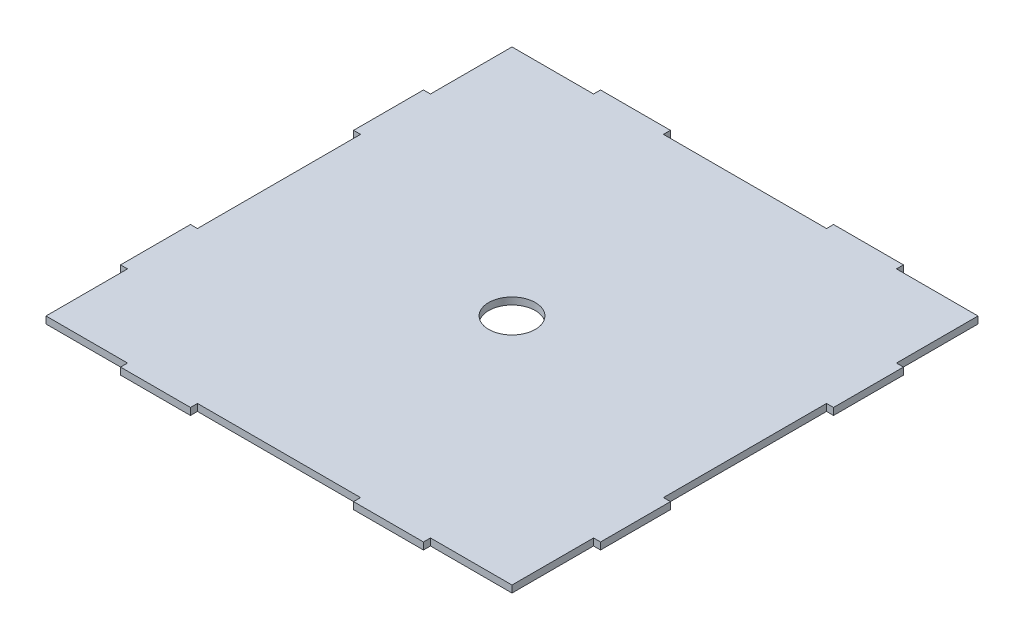
ISO-10303-21;
HEADER;
FILE_DESCRIPTION(('STEP AP214'),'2;1');
FILE_NAME('part.step','',(''),(''),'','','');
FILE_SCHEMA(('AUTOMOTIVE_DESIGN { 1 0 10303 214 1 1 1 1 }'));
ENDSEC;
DATA;
#1=APPLICATION_CONTEXT('core data for automotive mechanical design processes');
#2=APPLICATION_PROTOCOL_DEFINITION('international standard','automotive_design',2000,#1);
#3=PRODUCT_CONTEXT('',#1,'mechanical');
#4=PRODUCT('Part','Part','',(#3));
#5=PRODUCT_RELATED_PRODUCT_CATEGORY('part','',(#4));
#6=PRODUCT_DEFINITION_FORMATION('','',#4);
#7=PRODUCT_DEFINITION_CONTEXT('part definition',#1,'design');
#8=PRODUCT_DEFINITION('design','',#6,#7);
#9=PRODUCT_DEFINITION_SHAPE('','',#8);
#10=(LENGTH_UNIT() NAMED_UNIT(*) SI_UNIT(.MILLI.,.METRE.));
#11=(NAMED_UNIT(*) PLANE_ANGLE_UNIT() SI_UNIT($,.RADIAN.));
#12=(NAMED_UNIT(*) SI_UNIT($,.STERADIAN.) SOLID_ANGLE_UNIT());
#13=UNCERTAINTY_MEASURE_WITH_UNIT(LENGTH_MEASURE(1.E-05),#10,'distance_accuracy_value','');
#14=(GEOMETRIC_REPRESENTATION_CONTEXT(3) GLOBAL_UNCERTAINTY_ASSIGNED_CONTEXT((#13)) GLOBAL_UNIT_ASSIGNED_CONTEXT((#10,
#11,#12)) REPRESENTATION_CONTEXT('',''));
#15=CARTESIAN_POINT('',(0.,0.,0.));
#16=DIRECTION('',(0.,0.,1.));
#17=DIRECTION('',(1.,0.,0.));
#18=AXIS2_PLACEMENT_3D('',#15,#16,#17);
#19=CARTESIAN_POINT('',(-100.,3.,-100.));
#20=DIRECTION('',(0.,0.,1.));
#21=DIRECTION('',(1.,0.,0.));
#22=AXIS2_PLACEMENT_3D('',#19,#20,#21);
#23=PLANE('',#22);
#24=DIRECTION('',(-1.,0.,0.));
#25=VECTOR('',#24,1.);
#26=CARTESIAN_POINT('',(-100.,3.,-100.));
#27=LINE('',#26,#25);
#28=CARTESIAN_POINT('',(35.000000000001,3.,-100.));
#29=VERTEX_POINT('',#28);
#30=CARTESIAN_POINT('',(-34.999999999999,3.,-100.));
#31=VERTEX_POINT('',#30);
#32=EDGE_CURVE('E56',#29,#31,#27,.T.);
#33=ORIENTED_EDGE('',*,*,#32,.F.);
#34=DIRECTION('',(0.,1.,0.));
#35=VECTOR('',#34,1.);
#36=CARTESIAN_POINT('',(35.000000000001,0.,-99.9999999999997));
#37=LINE('',#36,#35);
#38=CARTESIAN_POINT('',(35.000000000001,0.,-99.9999999999997));
#39=VERTEX_POINT('',#38);
#40=EDGE_CURVE('E315',#39,#29,#37,.T.);
#41=ORIENTED_EDGE('',*,*,#40,.F.);
#42=DIRECTION('',(-1.,0.,0.));
#43=VECTOR('',#42,1.);
#44=CARTESIAN_POINT('',(-100.,0.,-100.));
#45=LINE('',#44,#43);
#46=CARTESIAN_POINT('',(-34.999999999999,0.,-100.));
#47=VERTEX_POINT('',#46);
#48=EDGE_CURVE('E613',#39,#47,#45,.T.);
#49=ORIENTED_EDGE('',*,*,#48,.T.);
#50=DIRECTION('',(0.,1.,0.));
#51=VECTOR('',#50,1.);
#52=CARTESIAN_POINT('',(-34.999999999999,0.,-100.));
#53=LINE('',#52,#51);
#54=EDGE_CURVE('E353',#47,#31,#53,.T.);
#55=ORIENTED_EDGE('',*,*,#54,.T.);
#56=EDGE_LOOP('',(#33,#41,#49,#55));
#57=FACE_BOUND('',#56,.T.);
#58=ADVANCED_FACE('F39',(#57),#23,.F.);
#59=DIRECTION('',(0.,1.,0.));
#60=VECTOR('',#59,1.);
#61=CARTESIAN_POINT('',(-64.999999999999,0.,-100.000000000001));
#62=LINE('',#61,#60);
#63=CARTESIAN_POINT('',(-64.999999999999,0.,-100.000000000001));
#64=VERTEX_POINT('',#63);
#65=CARTESIAN_POINT('',(-64.999999999999,3.,-100.000000000001));
#66=VERTEX_POINT('',#65);
#67=EDGE_CURVE('E335',#64,#66,#62,.T.);
#68=ORIENTED_EDGE('',*,*,#67,.F.);
#69=CARTESIAN_POINT('',(-100.,0.,-100.));
#70=VERTEX_POINT('',#69);
#71=EDGE_CURVE('E606',#64,#70,#45,.T.);
#72=ORIENTED_EDGE('',*,*,#71,.T.);
#73=DIRECTION('',(0.,-1.,0.));
#74=VECTOR('',#73,1.);
#75=CARTESIAN_POINT('',(-100.,3.,-100.));
#76=LINE('',#75,#74);
#77=CARTESIAN_POINT('',(-100.,3.,-100.));
#78=VERTEX_POINT('',#77);
#79=EDGE_CURVE('E49',#78,#70,#76,.T.);
#80=ORIENTED_EDGE('',*,*,#79,.F.);
#81=EDGE_CURVE('E584',#66,#78,#27,.T.);
#82=ORIENTED_EDGE('',*,*,#81,.F.);
#83=EDGE_LOOP('',(#68,#72,#80,#82));
#84=FACE_BOUND('',#83,.T.);
#85=ADVANCED_FACE('F664',(#84),#23,.F.);
#86=CARTESIAN_POINT('',(-100.,3.,-100.));
#87=DIRECTION('',(1.,0.,0.));
#88=DIRECTION('',(0.,0.,-1.));
#89=AXIS2_PLACEMENT_3D('',#86,#87,#88);
#90=PLANE('',#89);
#91=DIRECTION('',(0.,0.,1.));
#92=VECTOR('',#91,1.);
#93=CARTESIAN_POINT('',(-100.,3.,-100.));
#94=LINE('',#93,#92);
#95=CARTESIAN_POINT('',(-100.,3.,-35.0000000000007));
#96=VERTEX_POINT('',#95);
#97=CARTESIAN_POINT('',(-100.,3.,34.9999999999993));
#98=VERTEX_POINT('',#97);
#99=EDGE_CURVE('E596',#96,#98,#94,.T.);
#100=ORIENTED_EDGE('',*,*,#99,.F.);
#101=DIRECTION('',(0.,1.,0.));
#102=VECTOR('',#101,1.);
#103=CARTESIAN_POINT('',(-99.9999999999998,0.,-35.0000000000007));
#104=LINE('',#103,#102);
#105=CARTESIAN_POINT('',(-99.9999999999998,0.,-35.0000000000007));
#106=VERTEX_POINT('',#105);
#107=EDGE_CURVE('E382',#106,#96,#104,.T.);
#108=ORIENTED_EDGE('',*,*,#107,.F.);
#109=DIRECTION('',(0.,0.,1.));
#110=VECTOR('',#109,1.);
#111=CARTESIAN_POINT('',(-100.,0.,-100.));
#112=LINE('',#111,#110);
#113=CARTESIAN_POINT('',(-100.,0.,34.9999999999993));
#114=VERTEX_POINT('',#113);
#115=EDGE_CURVE('E618',#106,#114,#112,.T.);
#116=ORIENTED_EDGE('',*,*,#115,.T.);
#117=DIRECTION('',(0.,1.,0.));
#118=VECTOR('',#117,1.);
#119=CARTESIAN_POINT('',(-100.,0.,34.9999999999993));
#120=LINE('',#119,#118);
#121=EDGE_CURVE('E425',#114,#98,#120,.T.);
#122=ORIENTED_EDGE('',*,*,#121,.T.);
#123=EDGE_LOOP('',(#100,#108,#116,#122));
#124=FACE_BOUND('',#123,.T.);
#125=ADVANCED_FACE('F686',(#124),#90,.F.);
#126=DIRECTION('',(0.,1.,0.));
#127=VECTOR('',#126,1.);
#128=CARTESIAN_POINT('',(-100.,0.,64.9999999999993));
#129=LINE('',#128,#127);
#130=CARTESIAN_POINT('',(-100.,0.,64.9999999999993));
#131=VERTEX_POINT('',#130);
#132=CARTESIAN_POINT('',(-100.,3.,64.9999999999993));
#133=VERTEX_POINT('',#132);
#134=EDGE_CURVE('E407',#131,#133,#129,.T.);
#135=ORIENTED_EDGE('',*,*,#134,.F.);
#136=CARTESIAN_POINT('',(-100.,0.,100.));
#137=VERTEX_POINT('',#136);
#138=EDGE_CURVE('E612',#131,#137,#112,.T.);
#139=ORIENTED_EDGE('',*,*,#138,.T.);
#140=DIRECTION('',(0.,-1.,0.));
#141=VECTOR('',#140,1.);
#142=CARTESIAN_POINT('',(-100.,3.,100.));
#143=LINE('',#142,#141);
#144=CARTESIAN_POINT('',(-100.,3.,100.));
#145=VERTEX_POINT('',#144);
#146=EDGE_CURVE('E626',#145,#137,#143,.T.);
#147=ORIENTED_EDGE('',*,*,#146,.F.);
#148=EDGE_CURVE('E590',#133,#145,#94,.T.);
#149=ORIENTED_EDGE('',*,*,#148,.F.);
#150=EDGE_LOOP('',(#135,#139,#147,#149));
#151=FACE_BOUND('',#150,.T.);
#152=ADVANCED_FACE('F694',(#151),#90,.F.);
#153=CARTESIAN_POINT('',(-100.,3.,100.));
#154=DIRECTION('',(0.,0.,-1.));
#155=DIRECTION('',(-1.,0.,0.));
#156=AXIS2_PLACEMENT_3D('',#153,#154,#155);
#157=PLANE('',#156);
#158=DIRECTION('',(1.,0.,0.));
#159=VECTOR('',#158,1.);
#160=CARTESIAN_POINT('',(-100.,3.,100.));
#161=LINE('',#160,#159);
#162=CARTESIAN_POINT('',(-35.0000000000003,3.,100.));
#163=VERTEX_POINT('',#162);
#164=CARTESIAN_POINT('',(34.9999999999997,3.,100.));
#165=VERTEX_POINT('',#164);
#166=EDGE_CURVE('E602',#163,#165,#161,.T.);
#167=ORIENTED_EDGE('',*,*,#166,.F.);
#168=DIRECTION('',(0.,1.,0.));
#169=VECTOR('',#168,1.);
#170=CARTESIAN_POINT('',(-35.0000000000003,0.,99.9999999999999));
#171=LINE('',#170,#169);
#172=CARTESIAN_POINT('',(-35.0000000000003,0.,99.9999999999999));
#173=VERTEX_POINT('',#172);
#174=EDGE_CURVE('E455',#173,#163,#171,.T.);
#175=ORIENTED_EDGE('',*,*,#174,.F.);
#176=DIRECTION('',(1.,0.,0.));
#177=VECTOR('',#176,1.);
#178=CARTESIAN_POINT('',(-100.,0.,100.));
#179=LINE('',#178,#177);
#180=CARTESIAN_POINT('',(34.9999999999997,0.,100.));
#181=VERTEX_POINT('',#180);
#182=EDGE_CURVE('E622',#173,#181,#179,.T.);
#183=ORIENTED_EDGE('',*,*,#182,.T.);
#184=DIRECTION('',(0.,1.,0.));
#185=VECTOR('',#184,1.);
#186=CARTESIAN_POINT('',(34.9999999999997,0.,100.));
#187=LINE('',#186,#185);
#188=EDGE_CURVE('E498',#181,#165,#187,.T.);
#189=ORIENTED_EDGE('',*,*,#188,.T.);
#190=EDGE_LOOP('',(#167,#175,#183,#189));
#191=FACE_BOUND('',#190,.T.);
#192=ADVANCED_FACE('F734',(#191),#157,.F.);
#193=DIRECTION('',(0.,1.,0.));
#194=VECTOR('',#193,1.);
#195=CARTESIAN_POINT('',(64.9999999999997,0.,100.));
#196=LINE('',#195,#194);
#197=CARTESIAN_POINT('',(64.9999999999997,0.,100.));
#198=VERTEX_POINT('',#197);
#199=CARTESIAN_POINT('',(64.9999999999997,3.,100.));
#200=VERTEX_POINT('',#199);
#201=EDGE_CURVE('E480',#198,#200,#196,.T.);
#202=ORIENTED_EDGE('',*,*,#201,.F.);
#203=CARTESIAN_POINT('',(100.,0.,100.));
#204=VERTEX_POINT('',#203);
#205=EDGE_CURVE('E617',#198,#204,#179,.T.);
#206=ORIENTED_EDGE('',*,*,#205,.T.);
#207=DIRECTION('',(0.,-1.,0.));
#208=VECTOR('',#207,1.);
#209=CARTESIAN_POINT('',(100.,3.,100.));
#210=LINE('',#209,#208);
#211=CARTESIAN_POINT('',(100.,3.,100.));
#212=VERTEX_POINT('',#211);
#213=EDGE_CURVE('E601',#212,#204,#210,.T.);
#214=ORIENTED_EDGE('',*,*,#213,.F.);
#215=EDGE_CURVE('E595',#200,#212,#161,.T.);
#216=ORIENTED_EDGE('',*,*,#215,.F.);
#217=EDGE_LOOP('',(#202,#206,#214,#216));
#218=FACE_BOUND('',#217,.T.);
#219=ADVANCED_FACE('F735',(#218),#157,.F.);
#220=CARTESIAN_POINT('',(100.,3.,-100.));
#221=DIRECTION('',(-1.,0.,0.));
#222=DIRECTION('',(0.,0.,1.));
#223=AXIS2_PLACEMENT_3D('',#220,#221,#222);
#224=PLANE('',#223);
#225=DIRECTION('',(0.,0.,-1.));
#226=VECTOR('',#225,1.);
#227=CARTESIAN_POINT('',(100.,3.,-100.));
#228=LINE('',#227,#226);
#229=CARTESIAN_POINT('',(100.,3.,35.));
#230=VERTEX_POINT('',#229);
#231=CARTESIAN_POINT('',(100.,3.,-35.));
#232=VERTEX_POINT('',#231);
#233=EDGE_CURVE('E585',#230,#232,#228,.T.);
#234=ORIENTED_EDGE('',*,*,#233,.F.);
#235=DIRECTION('',(0.,1.,0.));
#236=VECTOR('',#235,1.);
#237=CARTESIAN_POINT('',(100.,0.,35.));
#238=LINE('',#237,#236);
#239=CARTESIAN_POINT('',(100.,0.,35.));
#240=VERTEX_POINT('',#239);
#241=EDGE_CURVE('E528',#240,#230,#238,.T.);
#242=ORIENTED_EDGE('',*,*,#241,.F.);
#243=DIRECTION('',(0.,0.,-1.));
#244=VECTOR('',#243,1.);
#245=CARTESIAN_POINT('',(100.,0.,-100.));
#246=LINE('',#245,#244);
#247=CARTESIAN_POINT('',(100.,0.,-35.));
#248=VERTEX_POINT('',#247);
#249=EDGE_CURVE('E607',#240,#248,#246,.T.);
#250=ORIENTED_EDGE('',*,*,#249,.T.);
#251=DIRECTION('',(0.,1.,0.));
#252=VECTOR('',#251,1.);
#253=CARTESIAN_POINT('',(100.,0.,-35.));
#254=LINE('',#253,#252);
#255=EDGE_CURVE('E553',#248,#232,#254,.T.);
#256=ORIENTED_EDGE('',*,*,#255,.T.);
#257=EDGE_LOOP('',(#234,#242,#250,#256));
#258=FACE_BOUND('',#257,.T.);
#259=ADVANCED_FACE('F697',(#258),#224,.F.);
#260=DIRECTION('',(0.,1.,0.));
#261=VECTOR('',#260,1.);
#262=CARTESIAN_POINT('',(100.,0.,-65.));
#263=LINE('',#262,#261);
#264=CARTESIAN_POINT('',(100.,0.,-65.));
#265=VERTEX_POINT('',#264);
#266=CARTESIAN_POINT('',(100.,3.,-65.));
#267=VERTEX_POINT('',#266);
#268=EDGE_CURVE('E564',#265,#267,#263,.T.);
#269=ORIENTED_EDGE('',*,*,#268,.F.);
#270=CARTESIAN_POINT('',(100.,0.,-100.));
#271=VERTEX_POINT('',#270);
#272=EDGE_CURVE('E608',#265,#271,#246,.T.);
#273=ORIENTED_EDGE('',*,*,#272,.T.);
#274=DIRECTION('',(0.,-1.,0.));
#275=VECTOR('',#274,1.);
#276=CARTESIAN_POINT('',(100.,3.,-100.));
#277=LINE('',#276,#275);
#278=CARTESIAN_POINT('',(100.,3.,-100.));
#279=VERTEX_POINT('',#278);
#280=EDGE_CURVE('E11',#279,#271,#277,.T.);
#281=ORIENTED_EDGE('',*,*,#280,.F.);
#282=EDGE_CURVE('E586',#267,#279,#228,.T.);
#283=ORIENTED_EDGE('',*,*,#282,.F.);
#284=EDGE_LOOP('',(#269,#273,#281,#283));
#285=FACE_BOUND('',#284,.T.);
#286=ADVANCED_FACE('F695',(#285),#224,.F.);
#287=CARTESIAN_POINT('',(100.,0.,65.));
#288=VERTEX_POINT('',#287);
#289=EDGE_CURVE('E603',#204,#288,#246,.T.);
#290=ORIENTED_EDGE('',*,*,#289,.T.);
#291=DIRECTION('',(0.,1.,0.));
#292=VECTOR('',#291,1.);
#293=CARTESIAN_POINT('',(100.,0.,65.));
#294=LINE('',#293,#292);
#295=CARTESIAN_POINT('',(100.,3.,65.));
#296=VERTEX_POINT('',#295);
#297=EDGE_CURVE('E517',#288,#296,#294,.T.);
#298=ORIENTED_EDGE('',*,*,#297,.T.);
#299=EDGE_CURVE('E580',#212,#296,#228,.T.);
#300=ORIENTED_EDGE('',*,*,#299,.F.);
#301=ORIENTED_EDGE('',*,*,#213,.T.);
#302=EDGE_LOOP('',(#290,#298,#300,#301));
#303=FACE_BOUND('',#302,.T.);
#304=ADVANCED_FACE('F41',(#303),#224,.F.);
#305=CARTESIAN_POINT('',(65.0000000000011,0.,-100.));
#306=VERTEX_POINT('',#305);
#307=EDGE_CURVE('E609',#271,#306,#45,.T.);
#308=ORIENTED_EDGE('',*,*,#307,.T.);
#309=DIRECTION('',(0.,1.,0.));
#310=VECTOR('',#309,1.);
#311=CARTESIAN_POINT('',(65.000000000001,0.,-99.9999999999993));
#312=LINE('',#311,#310);
#313=CARTESIAN_POINT('',(65.0000000000011,3.,-100.));
#314=VERTEX_POINT('',#313);
#315=EDGE_CURVE('E64',#306,#314,#312,.T.);
#316=ORIENTED_EDGE('',*,*,#315,.T.);
#317=EDGE_CURVE('E587',#279,#314,#27,.T.);
#318=ORIENTED_EDGE('',*,*,#317,.F.);
#319=ORIENTED_EDGE('',*,*,#280,.T.);
#320=EDGE_LOOP('',(#308,#316,#318,#319));
#321=FACE_BOUND('',#320,.T.);
#322=ADVANCED_FACE('F681',(#321),#23,.F.);
#323=CARTESIAN_POINT('',(-100.,0.,-65.0000000000007));
#324=VERTEX_POINT('',#323);
#325=EDGE_CURVE('E614',#70,#324,#112,.T.);
#326=ORIENTED_EDGE('',*,*,#325,.T.);
#327=DIRECTION('',(0.,1.,0.));
#328=VECTOR('',#327,1.);
#329=CARTESIAN_POINT('',(-99.9999999999996,0.,-65.0000000000007));
#330=LINE('',#329,#328);
#331=CARTESIAN_POINT('',(-100.,3.,-65.0000000000007));
#332=VERTEX_POINT('',#331);
#333=EDGE_CURVE('E371',#324,#332,#330,.T.);
#334=ORIENTED_EDGE('',*,*,#333,.T.);
#335=EDGE_CURVE('E591',#78,#332,#94,.T.);
#336=ORIENTED_EDGE('',*,*,#335,.F.);
#337=ORIENTED_EDGE('',*,*,#79,.T.);
#338=EDGE_LOOP('',(#326,#334,#336,#337));
#339=FACE_BOUND('',#338,.T.);
#340=ADVANCED_FACE('F636',(#339),#90,.F.);
#341=CARTESIAN_POINT('',(-65.0000000000004,0.,100.));
#342=VERTEX_POINT('',#341);
#343=EDGE_CURVE('E619',#137,#342,#179,.T.);
#344=ORIENTED_EDGE('',*,*,#343,.T.);
#345=DIRECTION('',(0.,1.,0.));
#346=VECTOR('',#345,1.);
#347=CARTESIAN_POINT('',(-65.0000000000004,0.,99.9999999999998));
#348=LINE('',#347,#346);
#349=CARTESIAN_POINT('',(-65.0000000000004,3.,100.));
#350=VERTEX_POINT('',#349);
#351=EDGE_CURVE('E444',#342,#350,#348,.T.);
#352=ORIENTED_EDGE('',*,*,#351,.T.);
#353=EDGE_CURVE('E597',#145,#350,#161,.T.);
#354=ORIENTED_EDGE('',*,*,#353,.F.);
#355=ORIENTED_EDGE('',*,*,#146,.T.);
#356=EDGE_LOOP('',(#344,#352,#354,#355));
#357=FACE_BOUND('',#356,.T.);
#358=ADVANCED_FACE('F693',(#357),#157,.F.);
#359=CARTESIAN_POINT('',(0.,3.,0.));
#360=DIRECTION('',(0.,1.,0.));
#361=DIRECTION('',(0.,0.,1.));
#362=AXIS2_PLACEMENT_3D('',#359,#360,#361);
#363=PLANE('',#362);
#364=CARTESIAN_POINT('',(0.,3.,0.));
#365=DIRECTION('',(0.,1.,0.));
#366=DIRECTION('',(0.,0.,1.));
#367=AXIS2_PLACEMENT_3D('',#364,#365,#366);
#368=CIRCLE('',#367,10.);
#369=CARTESIAN_POINT('',(0.,3.,10.));
#370=VERTEX_POINT('',#369);
#371=EDGE_CURVE('E567',#370,#370,#368,.T.);
#372=ORIENTED_EDGE('',*,*,#371,.F.);
#373=EDGE_LOOP('',(#372));
#374=FACE_BOUND('',#373,.T.);
#375=ORIENTED_EDGE('',*,*,#299,.T.);
#376=DIRECTION('',(1.,0.,0.));
#377=VECTOR('',#376,1.);
#378=CARTESIAN_POINT('',(100.,3.,65.));
#379=LINE('',#378,#377);
#380=CARTESIAN_POINT('',(103.,3.,65.));
#381=VERTEX_POINT('',#380);
#382=EDGE_CURVE('E494',#296,#381,#379,.T.);
#383=ORIENTED_EDGE('',*,*,#382,.T.);
#384=DIRECTION('',(0.,0.,-1.));
#385=VECTOR('',#384,1.);
#386=CARTESIAN_POINT('',(103.,3.,65.));
#387=LINE('',#386,#385);
#388=CARTESIAN_POINT('',(103.,3.,35.));
#389=VERTEX_POINT('',#388);
#390=EDGE_CURVE('E521',#381,#389,#387,.T.);
#391=ORIENTED_EDGE('',*,*,#390,.T.);
#392=DIRECTION('',(-1.,0.,0.));
#393=VECTOR('',#392,1.);
#394=CARTESIAN_POINT('',(100.,3.,35.));
#395=LINE('',#394,#393);
#396=EDGE_CURVE('E509',#389,#230,#395,.T.);
#397=ORIENTED_EDGE('',*,*,#396,.T.);
#398=ORIENTED_EDGE('',*,*,#233,.T.);
#399=DIRECTION('',(1.,0.,0.));
#400=VECTOR('',#399,1.);
#401=CARTESIAN_POINT('',(100.,3.,-35.));
#402=LINE('',#401,#400);
#403=CARTESIAN_POINT('',(103.,3.,-35.));
#404=VERTEX_POINT('',#403);
#405=EDGE_CURVE('E532',#232,#404,#402,.T.);
#406=ORIENTED_EDGE('',*,*,#405,.T.);
#407=DIRECTION('',(0.,0.,-1.));
#408=VECTOR('',#407,1.);
#409=CARTESIAN_POINT('',(103.,3.,-65.));
#410=LINE('',#409,#408);
#411=CARTESIAN_POINT('',(103.,3.,-65.));
#412=VERTEX_POINT('',#411);
#413=EDGE_CURVE('E557',#404,#412,#410,.T.);
#414=ORIENTED_EDGE('',*,*,#413,.T.);
#415=DIRECTION('',(-1.,0.,0.));
#416=VECTOR('',#415,1.);
#417=CARTESIAN_POINT('',(100.,3.,-65.));
#418=LINE('',#417,#416);
#419=EDGE_CURVE('E546',#412,#267,#418,.T.);
#420=ORIENTED_EDGE('',*,*,#419,.T.);
#421=ORIENTED_EDGE('',*,*,#282,.T.);
#422=ORIENTED_EDGE('',*,*,#317,.T.);
#423=DIRECTION('',(0.,0.,-1.));
#424=VECTOR('',#423,1.);
#425=CARTESIAN_POINT('',(65.000000000001,3.,-99.9999999999993));
#426=LINE('',#425,#424);
#427=CARTESIAN_POINT('',(65.0000000000011,3.,-102.999999999999));
#428=VERTEX_POINT('',#427);
#429=EDGE_CURVE('E310',#314,#428,#426,.T.);
#430=ORIENTED_EDGE('',*,*,#429,.T.);
#431=DIRECTION('',(-1.,0.,0.));
#432=VECTOR('',#431,1.);
#433=CARTESIAN_POINT('',(65.0000000000011,3.,-102.999999999999));
#434=LINE('',#433,#432);
#435=CARTESIAN_POINT('',(35.0000000000011,3.,-103.));
#436=VERTEX_POINT('',#435);
#437=EDGE_CURVE('E282',#428,#436,#434,.T.);
#438=ORIENTED_EDGE('',*,*,#437,.T.);
#439=DIRECTION('',(0.,0.,1.));
#440=VECTOR('',#439,1.);
#441=CARTESIAN_POINT('',(35.000000000001,3.,-99.9999999999997));
#442=LINE('',#441,#440);
#443=EDGE_CURVE('E302',#436,#29,#442,.T.);
#444=ORIENTED_EDGE('',*,*,#443,.T.);
#445=ORIENTED_EDGE('',*,*,#32,.T.);
#446=DIRECTION('',(0.,0.,-1.));
#447=VECTOR('',#446,1.);
#448=CARTESIAN_POINT('',(-34.999999999999,3.,-100.));
#449=LINE('',#448,#447);
#450=CARTESIAN_POINT('',(-34.9999999999989,3.,-103.));
#451=VERTEX_POINT('',#450);
#452=EDGE_CURVE('E339',#31,#451,#449,.T.);
#453=ORIENTED_EDGE('',*,*,#452,.T.);
#454=DIRECTION('',(-1.,0.,0.));
#455=VECTOR('',#454,1.);
#456=CARTESIAN_POINT('',(-64.9999999999989,3.,-103.000000000001));
#457=LINE('',#456,#455);
#458=CARTESIAN_POINT('',(-64.9999999999989,3.,-103.000000000001));
#459=VERTEX_POINT('',#458);
#460=EDGE_CURVE('E327',#451,#459,#457,.T.);
#461=ORIENTED_EDGE('',*,*,#460,.T.);
#462=DIRECTION('',(0.,0.,1.));
#463=VECTOR('',#462,1.);
#464=CARTESIAN_POINT('',(-64.999999999999,3.,-100.000000000001));
#465=LINE('',#464,#463);
#466=EDGE_CURVE('E318',#459,#66,#465,.T.);
#467=ORIENTED_EDGE('',*,*,#466,.T.);
#468=ORIENTED_EDGE('',*,*,#81,.T.);
#469=ORIENTED_EDGE('',*,*,#335,.T.);
#470=DIRECTION('',(-1.,0.,0.));
#471=VECTOR('',#470,1.);
#472=CARTESIAN_POINT('',(-99.9999999999996,3.,-65.0000000000007));
#473=LINE('',#472,#471);
#474=CARTESIAN_POINT('',(-103.,3.,-65.0000000000007));
#475=VERTEX_POINT('',#474);
#476=EDGE_CURVE('E349',#332,#475,#473,.T.);
#477=ORIENTED_EDGE('',*,*,#476,.T.);
#478=DIRECTION('',(0.,0.,1.));
#479=VECTOR('',#478,1.);
#480=CARTESIAN_POINT('',(-103.,3.,-65.0000000000007));
#481=LINE('',#480,#479);
#482=CARTESIAN_POINT('',(-103.,3.,-35.0000000000007));
#483=VERTEX_POINT('',#482);
#484=EDGE_CURVE('E375',#475,#483,#481,.T.);
#485=ORIENTED_EDGE('',*,*,#484,.T.);
#486=DIRECTION('',(1.,0.,0.));
#487=VECTOR('',#486,1.);
#488=CARTESIAN_POINT('',(-99.9999999999998,3.,-35.0000000000007));
#489=LINE('',#488,#487);
#490=EDGE_CURVE('E363',#483,#96,#489,.T.);
#491=ORIENTED_EDGE('',*,*,#490,.T.);
#492=ORIENTED_EDGE('',*,*,#99,.T.);
#493=DIRECTION('',(-1.,0.,0.));
#494=VECTOR('',#493,1.);
#495=CARTESIAN_POINT('',(-100.,3.,34.9999999999993));
#496=LINE('',#495,#494);
#497=CARTESIAN_POINT('',(-103.,3.,34.9999999999993));
#498=VERTEX_POINT('',#497);
#499=EDGE_CURVE('E411',#98,#498,#496,.T.);
#500=ORIENTED_EDGE('',*,*,#499,.T.);
#501=DIRECTION('',(0.,0.,1.));
#502=VECTOR('',#501,1.);
#503=CARTESIAN_POINT('',(-103.,3.,64.9999999999993));
#504=LINE('',#503,#502);
#505=CARTESIAN_POINT('',(-103.,3.,64.9999999999993));
#506=VERTEX_POINT('',#505);
#507=EDGE_CURVE('E399',#498,#506,#504,.T.);
#508=ORIENTED_EDGE('',*,*,#507,.T.);
#509=DIRECTION('',(1.,0.,0.));
#510=VECTOR('',#509,1.);
#511=CARTESIAN_POINT('',(-100.,3.,64.9999999999993));
#512=LINE('',#511,#510);
#513=EDGE_CURVE('E386',#506,#133,#512,.T.);
#514=ORIENTED_EDGE('',*,*,#513,.T.);
#515=ORIENTED_EDGE('',*,*,#148,.T.);
#516=ORIENTED_EDGE('',*,*,#353,.T.);
#517=DIRECTION('',(0.,0.,1.));
#518=VECTOR('',#517,1.);
#519=CARTESIAN_POINT('',(-65.0000000000004,3.,99.9999999999998));
#520=LINE('',#519,#518);
#521=CARTESIAN_POINT('',(-65.0000000000004,3.,103.));
#522=VERTEX_POINT('',#521);
#523=EDGE_CURVE('E421',#350,#522,#520,.T.);
#524=ORIENTED_EDGE('',*,*,#523,.T.);
#525=DIRECTION('',(1.,0.,0.));
#526=VECTOR('',#525,1.);
#527=CARTESIAN_POINT('',(-65.0000000000004,3.,103.));
#528=LINE('',#527,#526);
#529=CARTESIAN_POINT('',(-35.0000000000004,3.,103.));
#530=VERTEX_POINT('',#529);
#531=EDGE_CURVE('E448',#522,#530,#528,.T.);
#532=ORIENTED_EDGE('',*,*,#531,.T.);
#533=DIRECTION('',(0.,0.,-1.));
#534=VECTOR('',#533,1.);
#535=CARTESIAN_POINT('',(-35.0000000000003,3.,99.9999999999999));
#536=LINE('',#535,#534);
#537=EDGE_CURVE('E436',#530,#163,#536,.T.);
#538=ORIENTED_EDGE('',*,*,#537,.T.);
#539=ORIENTED_EDGE('',*,*,#166,.T.);
#540=DIRECTION('',(0.,0.,1.));
#541=VECTOR('',#540,1.);
#542=CARTESIAN_POINT('',(34.9999999999997,3.,100.));
#543=LINE('',#542,#541);
#544=CARTESIAN_POINT('',(34.9999999999996,3.,103.));
#545=VERTEX_POINT('',#544);
#546=EDGE_CURVE('E484',#165,#545,#543,.T.);
#547=ORIENTED_EDGE('',*,*,#546,.T.);
#548=DIRECTION('',(1.,0.,0.));
#549=VECTOR('',#548,1.);
#550=CARTESIAN_POINT('',(64.9999999999996,3.,103.));
#551=LINE('',#550,#549);
#552=CARTESIAN_POINT('',(64.9999999999996,3.,103.));
#553=VERTEX_POINT('',#552);
#554=EDGE_CURVE('E472',#545,#553,#551,.T.);
#555=ORIENTED_EDGE('',*,*,#554,.T.);
#556=DIRECTION('',(0.,0.,-1.));
#557=VECTOR('',#556,1.);
#558=CARTESIAN_POINT('',(64.9999999999997,3.,100.));
#559=LINE('',#558,#557);
#560=EDGE_CURVE('E459',#553,#200,#559,.T.);
#561=ORIENTED_EDGE('',*,*,#560,.T.);
#562=ORIENTED_EDGE('',*,*,#215,.T.);
#563=EDGE_LOOP('',(#375,#383,#391,#397,#398,#406,#414,#420,#421,#422,#430,#438,#444,#445,#453,
#461,#467,#468,#469,#477,#485,#491,#492,#500,#508,#514,#515,#516,#524,#532,#538,#539,#547,#555,
#561,#562));
#564=FACE_BOUND('',#563,.T.);
#565=ADVANCED_FACE('F650',(#374,#564),#363,.T.);
#566=CARTESIAN_POINT('',(0.,0.,0.));
#567=DIRECTION('',(0.,1.,0.));
#568=DIRECTION('',(0.,0.,1.));
#569=AXIS2_PLACEMENT_3D('',#566,#567,#568);
#570=PLANE('',#569);
#571=CARTESIAN_POINT('',(0.,0.,0.));
#572=DIRECTION('',(0.,1.,0.));
#573=DIRECTION('',(0.,0.,1.));
#574=AXIS2_PLACEMENT_3D('',#571,#572,#573);
#575=CIRCLE('',#574,10.);
#576=CARTESIAN_POINT('',(0.,0.,10.));
#577=VERTEX_POINT('',#576);
#578=EDGE_CURVE('E43',#577,#577,#575,.T.);
#579=ORIENTED_EDGE('',*,*,#578,.T.);
#580=EDGE_LOOP('',(#579));
#581=FACE_BOUND('',#580,.T.);
#582=ORIENTED_EDGE('',*,*,#289,.F.);
#583=ORIENTED_EDGE('',*,*,#205,.F.);
#584=DIRECTION('',(0.,0.,-1.));
#585=VECTOR('',#584,1.);
#586=CARTESIAN_POINT('',(64.9999999999997,0.,100.));
#587=LINE('',#586,#585);
#588=CARTESIAN_POINT('',(64.9999999999996,0.,103.));
#589=VERTEX_POINT('',#588);
#590=EDGE_CURVE('E468',#589,#198,#587,.T.);
#591=ORIENTED_EDGE('',*,*,#590,.F.);
#592=DIRECTION('',(1.,0.,0.));
#593=VECTOR('',#592,1.);
#594=CARTESIAN_POINT('',(64.9999999999996,0.,103.));
#595=LINE('',#594,#593);
#596=CARTESIAN_POINT('',(34.9999999999996,0.,103.));
#597=VERTEX_POINT('',#596);
#598=EDGE_CURVE('E476',#597,#589,#595,.T.);
#599=ORIENTED_EDGE('',*,*,#598,.F.);
#600=DIRECTION('',(0.,0.,1.));
#601=VECTOR('',#600,1.);
#602=CARTESIAN_POINT('',(34.9999999999997,0.,100.));
#603=LINE('',#602,#601);
#604=EDGE_CURVE('E471',#181,#597,#603,.T.);
#605=ORIENTED_EDGE('',*,*,#604,.F.);
#606=ORIENTED_EDGE('',*,*,#182,.F.);
#607=DIRECTION('',(0.,0.,-1.));
#608=VECTOR('',#607,1.);
#609=CARTESIAN_POINT('',(-35.0000000000003,0.,99.9999999999999));
#610=LINE('',#609,#608);
#611=CARTESIAN_POINT('',(-35.0000000000004,0.,103.));
#612=VERTEX_POINT('',#611);
#613=EDGE_CURVE('E440',#612,#173,#610,.T.);
#614=ORIENTED_EDGE('',*,*,#613,.F.);
#615=DIRECTION('',(1.,0.,0.));
#616=VECTOR('',#615,1.);
#617=CARTESIAN_POINT('',(-65.0000000000004,0.,103.));
#618=LINE('',#617,#616);
#619=CARTESIAN_POINT('',(-65.0000000000004,0.,103.));
#620=VERTEX_POINT('',#619);
#621=EDGE_CURVE('E435',#620,#612,#618,.T.);
#622=ORIENTED_EDGE('',*,*,#621,.F.);
#623=DIRECTION('',(0.,0.,1.));
#624=VECTOR('',#623,1.);
#625=CARTESIAN_POINT('',(-65.0000000000004,0.,99.9999999999998));
#626=LINE('',#625,#624);
#627=EDGE_CURVE('E431',#342,#620,#626,.T.);
#628=ORIENTED_EDGE('',*,*,#627,.F.);
#629=ORIENTED_EDGE('',*,*,#343,.F.);
#630=ORIENTED_EDGE('',*,*,#138,.F.);
#631=DIRECTION('',(1.,0.,0.));
#632=VECTOR('',#631,1.);
#633=CARTESIAN_POINT('',(-100.,0.,64.9999999999993));
#634=LINE('',#633,#632);
#635=CARTESIAN_POINT('',(-103.,0.,64.9999999999993));
#636=VERTEX_POINT('',#635);
#637=EDGE_CURVE('E395',#636,#131,#634,.T.);
#638=ORIENTED_EDGE('',*,*,#637,.F.);
#639=DIRECTION('',(0.,0.,1.));
#640=VECTOR('',#639,1.);
#641=CARTESIAN_POINT('',(-103.,0.,64.9999999999993));
#642=LINE('',#641,#640);
#643=CARTESIAN_POINT('',(-103.,0.,34.9999999999993));
#644=VERTEX_POINT('',#643);
#645=EDGE_CURVE('E403',#644,#636,#642,.T.);
#646=ORIENTED_EDGE('',*,*,#645,.F.);
#647=DIRECTION('',(-1.,0.,0.));
#648=VECTOR('',#647,1.);
#649=CARTESIAN_POINT('',(-100.,0.,34.9999999999993));
#650=LINE('',#649,#648);
#651=EDGE_CURVE('E398',#114,#644,#650,.T.);
#652=ORIENTED_EDGE('',*,*,#651,.F.);
#653=ORIENTED_EDGE('',*,*,#115,.F.);
#654=DIRECTION('',(1.,0.,0.));
#655=VECTOR('',#654,1.);
#656=CARTESIAN_POINT('',(-99.9999999999998,0.,-35.0000000000007));
#657=LINE('',#656,#655);
#658=CARTESIAN_POINT('',(-103.,0.,-35.0000000000007));
#659=VERTEX_POINT('',#658);
#660=EDGE_CURVE('E367',#659,#106,#657,.T.);
#661=ORIENTED_EDGE('',*,*,#660,.F.);
#662=DIRECTION('',(0.,0.,1.));
#663=VECTOR('',#662,1.);
#664=CARTESIAN_POINT('',(-103.,0.,-65.0000000000007));
#665=LINE('',#664,#663);
#666=CARTESIAN_POINT('',(-103.,0.,-65.0000000000007));
#667=VERTEX_POINT('',#666);
#668=EDGE_CURVE('E362',#667,#659,#665,.T.);
#669=ORIENTED_EDGE('',*,*,#668,.F.);
#670=DIRECTION('',(-1.,0.,0.));
#671=VECTOR('',#670,1.);
#672=CARTESIAN_POINT('',(-99.9999999999996,0.,-65.0000000000007));
#673=LINE('',#672,#671);
#674=EDGE_CURVE('E358',#324,#667,#673,.T.);
#675=ORIENTED_EDGE('',*,*,#674,.F.);
#676=ORIENTED_EDGE('',*,*,#325,.F.);
#677=ORIENTED_EDGE('',*,*,#71,.F.);
#678=DIRECTION('',(0.,0.,1.));
#679=VECTOR('',#678,1.);
#680=CARTESIAN_POINT('',(-64.999999999999,0.,-100.000000000001));
#681=LINE('',#680,#679);
#682=CARTESIAN_POINT('',(-64.9999999999989,0.,-103.000000000001));
#683=VERTEX_POINT('',#682);
#684=EDGE_CURVE('E323',#683,#64,#681,.T.);
#685=ORIENTED_EDGE('',*,*,#684,.F.);
#686=DIRECTION('',(-1.,0.,0.));
#687=VECTOR('',#686,1.);
#688=CARTESIAN_POINT('',(-64.9999999999989,0.,-103.000000000001));
#689=LINE('',#688,#687);
#690=CARTESIAN_POINT('',(-34.9999999999989,0.,-103.));
#691=VERTEX_POINT('',#690);
#692=EDGE_CURVE('E331',#691,#683,#689,.T.);
#693=ORIENTED_EDGE('',*,*,#692,.F.);
#694=DIRECTION('',(0.,0.,-1.));
#695=VECTOR('',#694,1.);
#696=CARTESIAN_POINT('',(-34.999999999999,0.,-100.));
#697=LINE('',#696,#695);
#698=EDGE_CURVE('E326',#47,#691,#697,.T.);
#699=ORIENTED_EDGE('',*,*,#698,.F.);
#700=ORIENTED_EDGE('',*,*,#48,.F.);
#701=DIRECTION('',(0.,0.,1.));
#702=VECTOR('',#701,1.);
#703=CARTESIAN_POINT('',(35.000000000001,0.,-99.9999999999997));
#704=LINE('',#703,#702);
#705=CARTESIAN_POINT('',(35.0000000000011,0.,-103.));
#706=VERTEX_POINT('',#705);
#707=EDGE_CURVE('E297',#706,#39,#704,.T.);
#708=ORIENTED_EDGE('',*,*,#707,.F.);
#709=DIRECTION('',(-1.,0.,0.));
#710=VECTOR('',#709,1.);
#711=CARTESIAN_POINT('',(65.0000000000011,0.,-102.999999999999));
#712=LINE('',#711,#710);
#713=CARTESIAN_POINT('',(65.0000000000011,0.,-102.999999999999));
#714=VERTEX_POINT('',#713);
#715=EDGE_CURVE('E279',#714,#706,#712,.T.);
#716=ORIENTED_EDGE('',*,*,#715,.F.);
#717=DIRECTION('',(0.,0.,-1.));
#718=VECTOR('',#717,1.);
#719=CARTESIAN_POINT('',(65.000000000001,0.,-99.9999999999993));
#720=LINE('',#719,#718);
#721=EDGE_CURVE('E295',#306,#714,#720,.T.);
#722=ORIENTED_EDGE('',*,*,#721,.F.);
#723=ORIENTED_EDGE('',*,*,#307,.F.);
#724=ORIENTED_EDGE('',*,*,#272,.F.);
#725=DIRECTION('',(-1.,0.,0.));
#726=VECTOR('',#725,1.);
#727=CARTESIAN_POINT('',(100.,0.,-65.));
#728=LINE('',#727,#726);
#729=CARTESIAN_POINT('',(103.,0.,-65.));
#730=VERTEX_POINT('',#729);
#731=EDGE_CURVE('E550',#730,#265,#728,.T.);
#732=ORIENTED_EDGE('',*,*,#731,.F.);
#733=DIRECTION('',(0.,0.,-1.));
#734=VECTOR('',#733,1.);
#735=CARTESIAN_POINT('',(103.,0.,-65.));
#736=LINE('',#735,#734);
#737=CARTESIAN_POINT('',(103.,0.,-35.));
#738=VERTEX_POINT('',#737);
#739=EDGE_CURVE('E545',#738,#730,#736,.T.);
#740=ORIENTED_EDGE('',*,*,#739,.F.);
#741=DIRECTION('',(1.,0.,0.));
#742=VECTOR('',#741,1.);
#743=CARTESIAN_POINT('',(100.,0.,-35.));
#744=LINE('',#743,#742);
#745=EDGE_CURVE('E541',#248,#738,#744,.T.);
#746=ORIENTED_EDGE('',*,*,#745,.F.);
#747=ORIENTED_EDGE('',*,*,#249,.F.);
#748=DIRECTION('',(-1.,0.,0.));
#749=VECTOR('',#748,1.);
#750=CARTESIAN_POINT('',(100.,0.,35.));
#751=LINE('',#750,#749);
#752=CARTESIAN_POINT('',(103.,0.,35.));
#753=VERTEX_POINT('',#752);
#754=EDGE_CURVE('E513',#753,#240,#751,.T.);
#755=ORIENTED_EDGE('',*,*,#754,.F.);
#756=DIRECTION('',(0.,0.,-1.));
#757=VECTOR('',#756,1.);
#758=CARTESIAN_POINT('',(103.,0.,65.));
#759=LINE('',#758,#757);
#760=CARTESIAN_POINT('',(103.,0.,65.));
#761=VERTEX_POINT('',#760);
#762=EDGE_CURVE('E508',#761,#753,#759,.T.);
#763=ORIENTED_EDGE('',*,*,#762,.F.);
#764=DIRECTION('',(1.,0.,0.));
#765=VECTOR('',#764,1.);
#766=CARTESIAN_POINT('',(100.,0.,65.));
#767=LINE('',#766,#765);
#768=EDGE_CURVE('E504',#288,#761,#767,.T.);
#769=ORIENTED_EDGE('',*,*,#768,.F.);
#770=EDGE_LOOP('',(#582,#583,#591,#599,#605,#606,#614,#622,#628,#629,#630,#638,#646,#652,#653,
#661,#669,#675,#676,#677,#685,#693,#699,#700,#708,#716,#722,#723,#724,#732,#740,#746,#747,#755,
#763,#769));
#771=FACE_BOUND('',#770,.T.);
#772=ADVANCED_FACE('F293',(#581,#771),#570,.F.);
#773=CARTESIAN_POINT('',(0.,-7.,0.));
#774=DIRECTION('',(0.,1.,0.));
#775=DIRECTION('',(0.,0.,1.));
#776=AXIS2_PLACEMENT_3D('',#773,#774,#775);
#777=CYLINDRICAL_SURFACE('',#776,10.);
#778=ORIENTED_EDGE('',*,*,#371,.T.);
#779=EDGE_LOOP('',(#778));
#780=FACE_BOUND('',#779,.T.);
#781=ORIENTED_EDGE('',*,*,#578,.F.);
#782=EDGE_LOOP('',(#781));
#783=FACE_BOUND('',#782,.T.);
#784=ADVANCED_FACE('F711',(#780,#783),#777,.F.);
#785=CARTESIAN_POINT('',(100.,0.,-65.));
#786=DIRECTION('',(0.,0.,-1.));
#787=DIRECTION('',(-1.,0.,0.));
#788=AXIS2_PLACEMENT_3D('',#785,#786,#787);
#789=PLANE('',#788);
#790=ORIENTED_EDGE('',*,*,#419,.F.);
#791=DIRECTION('',(0.,1.,0.));
#792=VECTOR('',#791,1.);
#793=CARTESIAN_POINT('',(103.,0.,-65.));
#794=LINE('',#793,#792);
#795=EDGE_CURVE('E568',#730,#412,#794,.T.);
#796=ORIENTED_EDGE('',*,*,#795,.F.);
#797=ORIENTED_EDGE('',*,*,#731,.T.);
#798=ORIENTED_EDGE('',*,*,#268,.T.);
#799=EDGE_LOOP('',(#790,#796,#797,#798));
#800=FACE_BOUND('',#799,.T.);
#801=ADVANCED_FACE('F713',(#800),#789,.T.);
#802=CARTESIAN_POINT('',(103.,0.,-65.));
#803=DIRECTION('',(1.,0.,0.));
#804=DIRECTION('',(0.,0.,-1.));
#805=AXIS2_PLACEMENT_3D('',#802,#803,#804);
#806=PLANE('',#805);
#807=ORIENTED_EDGE('',*,*,#413,.F.);
#808=DIRECTION('',(0.,1.,0.));
#809=VECTOR('',#808,1.);
#810=CARTESIAN_POINT('',(103.,0.,-35.));
#811=LINE('',#810,#809);
#812=EDGE_CURVE('E571',#738,#404,#811,.T.);
#813=ORIENTED_EDGE('',*,*,#812,.F.);
#814=ORIENTED_EDGE('',*,*,#739,.T.);
#815=ORIENTED_EDGE('',*,*,#795,.T.);
#816=EDGE_LOOP('',(#807,#813,#814,#815));
#817=FACE_BOUND('',#816,.T.);
#818=ADVANCED_FACE('F720',(#817),#806,.T.);
#819=CARTESIAN_POINT('',(100.,0.,-35.));
#820=DIRECTION('',(0.,0.,1.));
#821=DIRECTION('',(1.,0.,0.));
#822=AXIS2_PLACEMENT_3D('',#819,#820,#821);
#823=PLANE('',#822);
#824=ORIENTED_EDGE('',*,*,#405,.F.);
#825=ORIENTED_EDGE('',*,*,#255,.F.);
#826=ORIENTED_EDGE('',*,*,#745,.T.);
#827=ORIENTED_EDGE('',*,*,#812,.T.);
#828=EDGE_LOOP('',(#824,#825,#826,#827));
#829=FACE_BOUND('',#828,.T.);
#830=ADVANCED_FACE('F727',(#829),#823,.T.);
#831=CARTESIAN_POINT('',(100.,0.,35.));
#832=DIRECTION('',(0.,0.,-1.));
#833=DIRECTION('',(-1.,0.,0.));
#834=AXIS2_PLACEMENT_3D('',#831,#832,#833);
#835=PLANE('',#834);
#836=ORIENTED_EDGE('',*,*,#396,.F.);
#837=DIRECTION('',(0.,1.,0.));
#838=VECTOR('',#837,1.);
#839=CARTESIAN_POINT('',(103.,0.,35.));
#840=LINE('',#839,#838);
#841=EDGE_CURVE('E533',#753,#389,#840,.T.);
#842=ORIENTED_EDGE('',*,*,#841,.F.);
#843=ORIENTED_EDGE('',*,*,#754,.T.);
#844=ORIENTED_EDGE('',*,*,#241,.T.);
#845=EDGE_LOOP('',(#836,#842,#843,#844));
#846=FACE_BOUND('',#845,.T.);
#847=ADVANCED_FACE('F782',(#846),#835,.T.);
#848=CARTESIAN_POINT('',(103.,0.,65.));
#849=DIRECTION('',(1.,0.,0.));
#850=DIRECTION('',(0.,0.,-1.));
#851=AXIS2_PLACEMENT_3D('',#848,#849,#850);
#852=PLANE('',#851);
#853=ORIENTED_EDGE('',*,*,#390,.F.);
#854=DIRECTION('',(0.,1.,0.));
#855=VECTOR('',#854,1.);
#856=CARTESIAN_POINT('',(103.,0.,65.));
#857=LINE('',#856,#855);
#858=EDGE_CURVE('E536',#761,#381,#857,.T.);
#859=ORIENTED_EDGE('',*,*,#858,.F.);
#860=ORIENTED_EDGE('',*,*,#762,.T.);
#861=ORIENTED_EDGE('',*,*,#841,.T.);
#862=EDGE_LOOP('',(#853,#859,#860,#861));
#863=FACE_BOUND('',#862,.T.);
#864=ADVANCED_FACE('F779',(#863),#852,.T.);
#865=CARTESIAN_POINT('',(100.,0.,65.));
#866=DIRECTION('',(0.,0.,1.));
#867=DIRECTION('',(1.,0.,0.));
#868=AXIS2_PLACEMENT_3D('',#865,#866,#867);
#869=PLANE('',#868);
#870=ORIENTED_EDGE('',*,*,#382,.F.);
#871=ORIENTED_EDGE('',*,*,#297,.F.);
#872=ORIENTED_EDGE('',*,*,#768,.T.);
#873=ORIENTED_EDGE('',*,*,#858,.T.);
#874=EDGE_LOOP('',(#870,#871,#872,#873));
#875=FACE_BOUND('',#874,.T.);
#876=ADVANCED_FACE('F774',(#875),#869,.T.);
#877=CARTESIAN_POINT('',(64.9999999999997,0.,100.));
#878=DIRECTION('',(1.,0.,0.));
#879=DIRECTION('',(0.,0.,-1.));
#880=AXIS2_PLACEMENT_3D('',#877,#878,#879);
#881=PLANE('',#880);
#882=ORIENTED_EDGE('',*,*,#560,.F.);
#883=DIRECTION('',(0.,1.,0.));
#884=VECTOR('',#883,1.);
#885=CARTESIAN_POINT('',(64.9999999999996,0.,103.));
#886=LINE('',#885,#884);
#887=EDGE_CURVE('E491',#589,#553,#886,.T.);
#888=ORIENTED_EDGE('',*,*,#887,.F.);
#889=ORIENTED_EDGE('',*,*,#590,.T.);
#890=ORIENTED_EDGE('',*,*,#201,.T.);
#891=EDGE_LOOP('',(#882,#888,#889,#890));
#892=FACE_BOUND('',#891,.T.);
#893=ADVANCED_FACE('F913',(#892),#881,.T.);
#894=CARTESIAN_POINT('',(64.9999999999996,0.,103.));
#895=DIRECTION('',(0.,0.,1.));
#896=DIRECTION('',(1.,0.,0.));
#897=AXIS2_PLACEMENT_3D('',#894,#895,#896);
#898=PLANE('',#897);
#899=ORIENTED_EDGE('',*,*,#554,.F.);
#900=DIRECTION('',(0.,1.,0.));
#901=VECTOR('',#900,1.);
#902=CARTESIAN_POINT('',(34.9999999999996,0.,103.));
#903=LINE('',#902,#901);
#904=EDGE_CURVE('E495',#597,#545,#903,.T.);
#905=ORIENTED_EDGE('',*,*,#904,.F.);
#906=ORIENTED_EDGE('',*,*,#598,.T.);
#907=ORIENTED_EDGE('',*,*,#887,.T.);
#908=EDGE_LOOP('',(#899,#905,#906,#907));
#909=FACE_BOUND('',#908,.T.);
#910=ADVANCED_FACE('F766',(#909),#898,.T.);
#911=CARTESIAN_POINT('',(34.9999999999997,0.,100.));
#912=DIRECTION('',(-1.,0.,0.));
#913=DIRECTION('',(0.,0.,1.));
#914=AXIS2_PLACEMENT_3D('',#911,#912,#913);
#915=PLANE('',#914);
#916=ORIENTED_EDGE('',*,*,#546,.F.);
#917=ORIENTED_EDGE('',*,*,#188,.F.);
#918=ORIENTED_EDGE('',*,*,#604,.T.);
#919=ORIENTED_EDGE('',*,*,#904,.T.);
#920=EDGE_LOOP('',(#916,#917,#918,#919));
#921=FACE_BOUND('',#920,.T.);
#922=ADVANCED_FACE('F763',(#921),#915,.T.);
#923=CARTESIAN_POINT('',(-35.0000000000003,0.,99.9999999999999));
#924=DIRECTION('',(1.,0.,0.));
#925=DIRECTION('',(0.,0.,-1.));
#926=AXIS2_PLACEMENT_3D('',#923,#924,#925);
#927=PLANE('',#926);
#928=ORIENTED_EDGE('',*,*,#537,.F.);
#929=DIRECTION('',(0.,1.,0.));
#930=VECTOR('',#929,1.);
#931=CARTESIAN_POINT('',(-35.0000000000004,0.,103.));
#932=LINE('',#931,#930);
#933=EDGE_CURVE('E460',#612,#530,#932,.T.);
#934=ORIENTED_EDGE('',*,*,#933,.F.);
#935=ORIENTED_EDGE('',*,*,#613,.T.);
#936=ORIENTED_EDGE('',*,*,#174,.T.);
#937=EDGE_LOOP('',(#928,#934,#935,#936));
#938=FACE_BOUND('',#937,.T.);
#939=ADVANCED_FACE('F932',(#938),#927,.T.);
#940=CARTESIAN_POINT('',(-65.0000000000004,0.,103.));
#941=DIRECTION('',(0.,0.,1.));
#942=DIRECTION('',(1.,0.,0.));
#943=AXIS2_PLACEMENT_3D('',#940,#941,#942);
#944=PLANE('',#943);
#945=ORIENTED_EDGE('',*,*,#531,.F.);
#946=DIRECTION('',(0.,1.,0.));
#947=VECTOR('',#946,1.);
#948=CARTESIAN_POINT('',(-65.0000000000004,0.,103.));
#949=LINE('',#948,#947);
#950=EDGE_CURVE('E463',#620,#522,#949,.T.);
#951=ORIENTED_EDGE('',*,*,#950,.F.);
#952=ORIENTED_EDGE('',*,*,#621,.T.);
#953=ORIENTED_EDGE('',*,*,#933,.T.);
#954=EDGE_LOOP('',(#945,#951,#952,#953));
#955=FACE_BOUND('',#954,.T.);
#956=ADVANCED_FACE('F939',(#955),#944,.T.);
#957=CARTESIAN_POINT('',(-65.0000000000004,0.,99.9999999999998));
#958=DIRECTION('',(-1.,0.,0.));
#959=DIRECTION('',(0.,0.,1.));
#960=AXIS2_PLACEMENT_3D('',#957,#958,#959);
#961=PLANE('',#960);
#962=ORIENTED_EDGE('',*,*,#523,.F.);
#963=ORIENTED_EDGE('',*,*,#351,.F.);
#964=ORIENTED_EDGE('',*,*,#627,.T.);
#965=ORIENTED_EDGE('',*,*,#950,.T.);
#966=EDGE_LOOP('',(#962,#963,#964,#965));
#967=FACE_BOUND('',#966,.T.);
#968=ADVANCED_FACE('F947',(#967),#961,.T.);
#969=CARTESIAN_POINT('',(-100.,0.,64.9999999999993));
#970=DIRECTION('',(0.,0.,1.));
#971=DIRECTION('',(1.,0.,0.));
#972=AXIS2_PLACEMENT_3D('',#969,#970,#971);
#973=PLANE('',#972);
#974=ORIENTED_EDGE('',*,*,#513,.F.);
#975=DIRECTION('',(0.,1.,0.));
#976=VECTOR('',#975,1.);
#977=CARTESIAN_POINT('',(-103.,0.,64.9999999999993));
#978=LINE('',#977,#976);
#979=EDGE_CURVE('E418',#636,#506,#978,.T.);
#980=ORIENTED_EDGE('',*,*,#979,.F.);
#981=ORIENTED_EDGE('',*,*,#637,.T.);
#982=ORIENTED_EDGE('',*,*,#134,.T.);
#983=EDGE_LOOP('',(#974,#980,#981,#982));
#984=FACE_BOUND('',#983,.T.);
#985=ADVANCED_FACE('F955',(#984),#973,.T.);
#986=CARTESIAN_POINT('',(-103.,0.,64.9999999999993));
#987=DIRECTION('',(-1.,0.,0.));
#988=DIRECTION('',(0.,0.,1.));
#989=AXIS2_PLACEMENT_3D('',#986,#987,#988);
#990=PLANE('',#989);
#991=ORIENTED_EDGE('',*,*,#507,.F.);
#992=DIRECTION('',(0.,1.,0.));
#993=VECTOR('',#992,1.);
#994=CARTESIAN_POINT('',(-103.,0.,34.9999999999993));
#995=LINE('',#994,#993);
#996=EDGE_CURVE('E422',#644,#498,#995,.T.);
#997=ORIENTED_EDGE('',*,*,#996,.F.);
#998=ORIENTED_EDGE('',*,*,#645,.T.);
#999=ORIENTED_EDGE('',*,*,#979,.T.);
#1000=EDGE_LOOP('',(#991,#997,#998,#999));
#1001=FACE_BOUND('',#1000,.T.);
#1002=ADVANCED_FACE('F963',(#1001),#990,.T.);
#1003=CARTESIAN_POINT('',(-100.,0.,34.9999999999993));
#1004=DIRECTION('',(0.,0.,-1.));
#1005=DIRECTION('',(-1.,0.,0.));
#1006=AXIS2_PLACEMENT_3D('',#1003,#1004,#1005);
#1007=PLANE('',#1006);
#1008=ORIENTED_EDGE('',*,*,#499,.F.);
#1009=ORIENTED_EDGE('',*,*,#121,.F.);
#1010=ORIENTED_EDGE('',*,*,#651,.T.);
#1011=ORIENTED_EDGE('',*,*,#996,.T.);
#1012=EDGE_LOOP('',(#1008,#1009,#1010,#1011));
#1013=FACE_BOUND('',#1012,.T.);
#1014=ADVANCED_FACE('F971',(#1013),#1007,.T.);
#1015=CARTESIAN_POINT('',(-99.9999999999998,0.,-35.0000000000007));
#1016=DIRECTION('',(0.,0.,1.));
#1017=DIRECTION('',(1.,0.,0.));
#1018=AXIS2_PLACEMENT_3D('',#1015,#1016,#1017);
#1019=PLANE('',#1018);
#1020=ORIENTED_EDGE('',*,*,#490,.F.);
#1021=DIRECTION('',(0.,1.,0.));
#1022=VECTOR('',#1021,1.);
#1023=CARTESIAN_POINT('',(-103.,0.,-35.0000000000007));
#1024=LINE('',#1023,#1022);
#1025=EDGE_CURVE('E387',#659,#483,#1024,.T.);
#1026=ORIENTED_EDGE('',*,*,#1025,.F.);
#1027=ORIENTED_EDGE('',*,*,#660,.T.);
#1028=ORIENTED_EDGE('',*,*,#107,.T.);
#1029=EDGE_LOOP('',(#1020,#1026,#1027,#1028));
#1030=FACE_BOUND('',#1029,.T.);
#1031=ADVANCED_FACE('F979',(#1030),#1019,.T.);
#1032=CARTESIAN_POINT('',(-103.,0.,-65.0000000000007));
#1033=DIRECTION('',(-1.,0.,0.));
#1034=DIRECTION('',(0.,0.,1.));
#1035=AXIS2_PLACEMENT_3D('',#1032,#1033,#1034);
#1036=PLANE('',#1035);
#1037=ORIENTED_EDGE('',*,*,#484,.F.);
#1038=DIRECTION('',(0.,1.,0.));
#1039=VECTOR('',#1038,1.);
#1040=CARTESIAN_POINT('',(-103.,0.,-65.0000000000007));
#1041=LINE('',#1040,#1039);
#1042=EDGE_CURVE('E390',#667,#475,#1041,.T.);
#1043=ORIENTED_EDGE('',*,*,#1042,.F.);
#1044=ORIENTED_EDGE('',*,*,#668,.T.);
#1045=ORIENTED_EDGE('',*,*,#1025,.T.);
#1046=EDGE_LOOP('',(#1037,#1043,#1044,#1045));
#1047=FACE_BOUND('',#1046,.T.);
#1048=ADVANCED_FACE('F987',(#1047),#1036,.T.);
#1049=CARTESIAN_POINT('',(-99.9999999999996,0.,-65.0000000000007));
#1050=DIRECTION('',(0.,0.,-1.));
#1051=DIRECTION('',(-1.,0.,0.));
#1052=AXIS2_PLACEMENT_3D('',#1049,#1050,#1051);
#1053=PLANE('',#1052);
#1054=ORIENTED_EDGE('',*,*,#476,.F.);
#1055=ORIENTED_EDGE('',*,*,#333,.F.);
#1056=ORIENTED_EDGE('',*,*,#674,.T.);
#1057=ORIENTED_EDGE('',*,*,#1042,.T.);
#1058=EDGE_LOOP('',(#1054,#1055,#1056,#1057));
#1059=FACE_BOUND('',#1058,.T.);
#1060=ADVANCED_FACE('F647',(#1059),#1053,.T.);
#1061=CARTESIAN_POINT('',(-64.999999999999,0.,-100.000000000001));
#1062=DIRECTION('',(-1.,0.,0.));
#1063=DIRECTION('',(0.,0.,1.));
#1064=AXIS2_PLACEMENT_3D('',#1061,#1062,#1063);
#1065=PLANE('',#1064);
#1066=ORIENTED_EDGE('',*,*,#466,.F.);
#1067=DIRECTION('',(0.,1.,0.));
#1068=VECTOR('',#1067,1.);
#1069=CARTESIAN_POINT('',(-64.9999999999989,0.,-103.000000000001));
#1070=LINE('',#1069,#1068);
#1071=EDGE_CURVE('E346',#683,#459,#1070,.T.);
#1072=ORIENTED_EDGE('',*,*,#1071,.F.);
#1073=ORIENTED_EDGE('',*,*,#684,.T.);
#1074=ORIENTED_EDGE('',*,*,#67,.T.);
#1075=EDGE_LOOP('',(#1066,#1072,#1073,#1074));
#1076=FACE_BOUND('',#1075,.T.);
#1077=ADVANCED_FACE('F666',(#1076),#1065,.T.);
#1078=CARTESIAN_POINT('',(-64.9999999999989,0.,-103.000000000001));
#1079=DIRECTION('',(0.,0.,-1.));
#1080=DIRECTION('',(-1.,0.,0.));
#1081=AXIS2_PLACEMENT_3D('',#1078,#1079,#1080);
#1082=PLANE('',#1081);
#1083=ORIENTED_EDGE('',*,*,#460,.F.);
#1084=DIRECTION('',(0.,1.,0.));
#1085=VECTOR('',#1084,1.);
#1086=CARTESIAN_POINT('',(-34.9999999999989,0.,-103.));
#1087=LINE('',#1086,#1085);
#1088=EDGE_CURVE('E350',#691,#451,#1087,.T.);
#1089=ORIENTED_EDGE('',*,*,#1088,.F.);
#1090=ORIENTED_EDGE('',*,*,#692,.T.);
#1091=ORIENTED_EDGE('',*,*,#1071,.T.);
#1092=EDGE_LOOP('',(#1083,#1089,#1090,#1091));
#1093=FACE_BOUND('',#1092,.T.);
#1094=ADVANCED_FACE('F669',(#1093),#1082,.T.);
#1095=CARTESIAN_POINT('',(-34.999999999999,0.,-100.));
#1096=DIRECTION('',(1.,0.,0.));
#1097=DIRECTION('',(0.,0.,-1.));
#1098=AXIS2_PLACEMENT_3D('',#1095,#1096,#1097);
#1099=PLANE('',#1098);
#1100=ORIENTED_EDGE('',*,*,#452,.F.);
#1101=ORIENTED_EDGE('',*,*,#54,.F.);
#1102=ORIENTED_EDGE('',*,*,#698,.T.);
#1103=ORIENTED_EDGE('',*,*,#1088,.T.);
#1104=EDGE_LOOP('',(#1100,#1101,#1102,#1103));
#1105=FACE_BOUND('',#1104,.T.);
#1106=ADVANCED_FACE('F660',(#1105),#1099,.T.);
#1107=CARTESIAN_POINT('',(35.000000000001,0.,-99.9999999999997));
#1108=DIRECTION('',(-1.,0.,0.));
#1109=DIRECTION('',(0.,0.,1.));
#1110=AXIS2_PLACEMENT_3D('',#1107,#1108,#1109);
#1111=PLANE('',#1110);
#1112=ORIENTED_EDGE('',*,*,#443,.F.);
#1113=DIRECTION('',(0.,1.,0.));
#1114=VECTOR('',#1113,1.);
#1115=CARTESIAN_POINT('',(35.0000000000011,0.,-103.));
#1116=LINE('',#1115,#1114);
#1117=EDGE_CURVE('E288',#706,#436,#1116,.T.);
#1118=ORIENTED_EDGE('',*,*,#1117,.F.);
#1119=ORIENTED_EDGE('',*,*,#707,.T.);
#1120=ORIENTED_EDGE('',*,*,#40,.T.);
#1121=EDGE_LOOP('',(#1112,#1118,#1119,#1120));
#1122=FACE_BOUND('',#1121,.T.);
#1123=ADVANCED_FACE('F676',(#1122),#1111,.T.);
#1124=CARTESIAN_POINT('',(65.0000000000011,0.,-102.999999999999));
#1125=DIRECTION('',(0.,0.,-1.));
#1126=DIRECTION('',(-1.,0.,0.));
#1127=AXIS2_PLACEMENT_3D('',#1124,#1125,#1126);
#1128=PLANE('',#1127);
#1129=ORIENTED_EDGE('',*,*,#437,.F.);
#1130=DIRECTION('',(0.,1.,0.));
#1131=VECTOR('',#1130,1.);
#1132=CARTESIAN_POINT('',(65.0000000000011,0.,-102.999999999999));
#1133=LINE('',#1132,#1131);
#1134=EDGE_CURVE('E276',#714,#428,#1133,.T.);
#1135=ORIENTED_EDGE('',*,*,#1134,.F.);
#1136=ORIENTED_EDGE('',*,*,#715,.T.);
#1137=ORIENTED_EDGE('',*,*,#1117,.T.);
#1138=EDGE_LOOP('',(#1129,#1135,#1136,#1137));
#1139=FACE_BOUND('',#1138,.T.);
#1140=ADVANCED_FACE('F278',(#1139),#1128,.T.);
#1141=CARTESIAN_POINT('',(65.000000000001,0.,-99.9999999999993));
#1142=DIRECTION('',(1.,0.,0.));
#1143=DIRECTION('',(0.,0.,-1.));
#1144=AXIS2_PLACEMENT_3D('',#1141,#1142,#1143);
#1145=PLANE('',#1144);
#1146=ORIENTED_EDGE('',*,*,#429,.F.);
#1147=ORIENTED_EDGE('',*,*,#315,.F.);
#1148=ORIENTED_EDGE('',*,*,#721,.T.);
#1149=ORIENTED_EDGE('',*,*,#1134,.T.);
#1150=EDGE_LOOP('',(#1146,#1147,#1148,#1149));
#1151=FACE_BOUND('',#1150,.T.);
#1152=ADVANCED_FACE('F300',(#1151),#1145,.T.);
#1153=CLOSED_SHELL('',(#58,#85,#125,#152,#192,#219,#259,#286,#304,#322,#340,#358,#565,#772,#784,
#801,#818,#830,#847,#864,#876,#893,#910,#922,#939,#956,#968,#985,#1002,#1014,#1031,#1048,#1060,
#1077,#1094,#1106,#1123,#1140,#1152));
#1154=MANIFOLD_SOLID_BREP('B2',#1153);
#1155=ADVANCED_BREP_SHAPE_REPRESENTATION('',(#18,#1154),#14);
#1156=SHAPE_DEFINITION_REPRESENTATION(#9,#1155);
ENDSEC;
END-ISO-10303-21;
